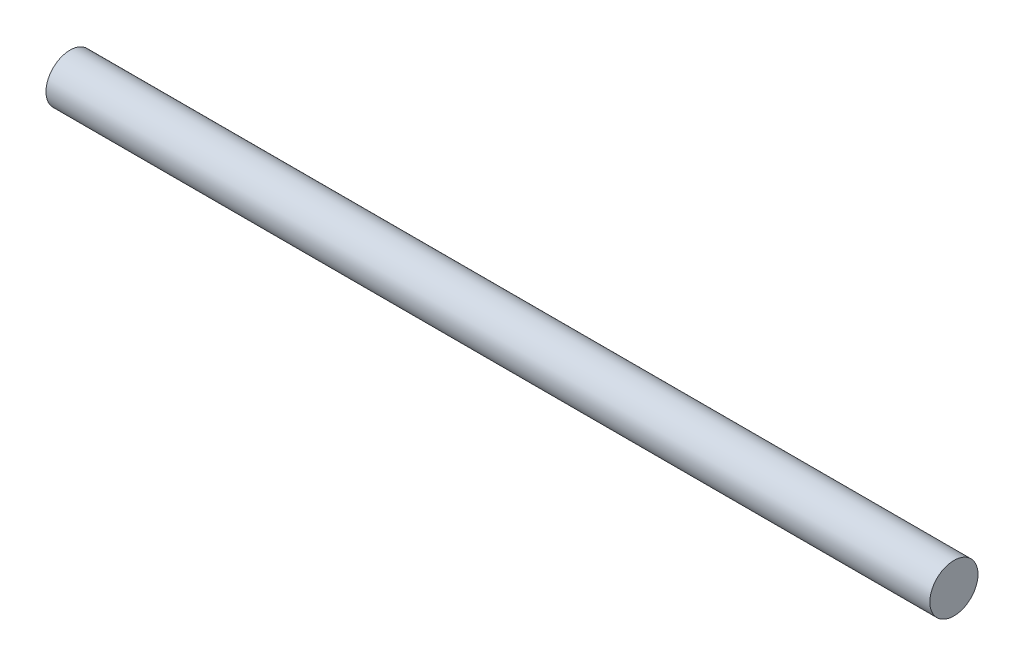
ISO-10303-21;
HEADER;
FILE_DESCRIPTION(('STEP AP214'),'2;1');
FILE_NAME('part.step','',(''),(''),'','','');
FILE_SCHEMA(('AUTOMOTIVE_DESIGN { 1 0 10303 214 1 1 1 1 }'));
ENDSEC;
DATA;
#1=APPLICATION_CONTEXT('core data for automotive mechanical design processes');
#2=APPLICATION_PROTOCOL_DEFINITION('international standard','automotive_design',2000,#1);
#3=PRODUCT_CONTEXT('',#1,'mechanical');
#4=PRODUCT('Part','Part','',(#3));
#5=PRODUCT_RELATED_PRODUCT_CATEGORY('part','',(#4));
#6=PRODUCT_DEFINITION_FORMATION('','',#4);
#7=PRODUCT_DEFINITION_CONTEXT('part definition',#1,'design');
#8=PRODUCT_DEFINITION('design','',#6,#7);
#9=PRODUCT_DEFINITION_SHAPE('','',#8);
#10=(LENGTH_UNIT() NAMED_UNIT(*) SI_UNIT(.MILLI.,.METRE.));
#11=(NAMED_UNIT(*) PLANE_ANGLE_UNIT() SI_UNIT($,.RADIAN.));
#12=(NAMED_UNIT(*) SI_UNIT($,.STERADIAN.) SOLID_ANGLE_UNIT());
#13=UNCERTAINTY_MEASURE_WITH_UNIT(LENGTH_MEASURE(1.E-05),#10,'distance_accuracy_value','');
#14=(GEOMETRIC_REPRESENTATION_CONTEXT(3) GLOBAL_UNCERTAINTY_ASSIGNED_CONTEXT((#13)) GLOBAL_UNIT_ASSIGNED_CONTEXT((#10,
#11,#12)) REPRESENTATION_CONTEXT('',''));
#15=CARTESIAN_POINT('',(0.,0.,0.));
#16=DIRECTION('',(0.,0.,1.));
#17=DIRECTION('',(1.,0.,0.));
#18=AXIS2_PLACEMENT_3D('',#15,#16,#17);
#19=CARTESIAN_POINT('',(-163.2,0.,0.));
#20=DIRECTION('',(1.,0.,0.));
#21=DIRECTION('',(0.,0.,-1.));
#22=AXIS2_PLACEMENT_3D('',#19,#20,#21);
#23=CYLINDRICAL_SURFACE('',#22,8.89);
#24=CARTESIAN_POINT('',(-163.2,0.,0.));
#25=DIRECTION('',(1.,0.,0.));
#26=DIRECTION('',(0.,0.,-1.));
#27=AXIS2_PLACEMENT_3D('',#24,#25,#26);
#28=CIRCLE('',#27,8.89);
#29=CARTESIAN_POINT('',(-163.2,0.,-8.89));
#30=VERTEX_POINT('',#29);
#31=EDGE_CURVE('E10',#30,#30,#28,.T.);
#32=ORIENTED_EDGE('',*,*,#31,.T.);
#33=EDGE_LOOP('',(#32));
#34=FACE_BOUND('',#33,.T.);
#35=CARTESIAN_POINT('',(163.2,0.,0.));
#36=DIRECTION('',(1.,0.,0.));
#37=DIRECTION('',(0.,0.,-1.));
#38=AXIS2_PLACEMENT_3D('',#35,#36,#37);
#39=CIRCLE('',#38,8.89);
#40=CARTESIAN_POINT('',(163.2,0.,-8.89));
#41=VERTEX_POINT('',#40);
#42=EDGE_CURVE('E47',#41,#41,#39,.T.);
#43=ORIENTED_EDGE('',*,*,#42,.F.);
#44=EDGE_LOOP('',(#43));
#45=FACE_BOUND('',#44,.T.);
#46=ADVANCED_FACE('F41',(#34,#45),#23,.T.);
#47=CARTESIAN_POINT('',(-163.2,0.,0.));
#48=DIRECTION('',(1.,0.,0.));
#49=DIRECTION('',(0.,0.,-1.));
#50=AXIS2_PLACEMENT_3D('',#47,#48,#49);
#51=PLANE('',#50);
#52=ORIENTED_EDGE('',*,*,#31,.F.);
#53=EDGE_LOOP('',(#52));
#54=FACE_BOUND('',#53,.T.);
#55=ADVANCED_FACE('F56',(#54),#51,.F.);
#56=CARTESIAN_POINT('',(163.2,0.,0.));
#57=DIRECTION('',(1.,0.,0.));
#58=DIRECTION('',(0.,0.,-1.));
#59=AXIS2_PLACEMENT_3D('',#56,#57,#58);
#60=PLANE('',#59);
#61=ORIENTED_EDGE('',*,*,#42,.T.);
#62=EDGE_LOOP('',(#61));
#63=FACE_BOUND('',#62,.T.);
#64=ADVANCED_FACE('F53',(#63),#60,.T.);
#65=CLOSED_SHELL('',(#46,#55,#64));
#66=MANIFOLD_SOLID_BREP('B2',#65);
#67=ADVANCED_BREP_SHAPE_REPRESENTATION('',(#18,#66),#14);
#68=SHAPE_DEFINITION_REPRESENTATION(#9,#67);
ENDSEC;
END-ISO-10303-21;
